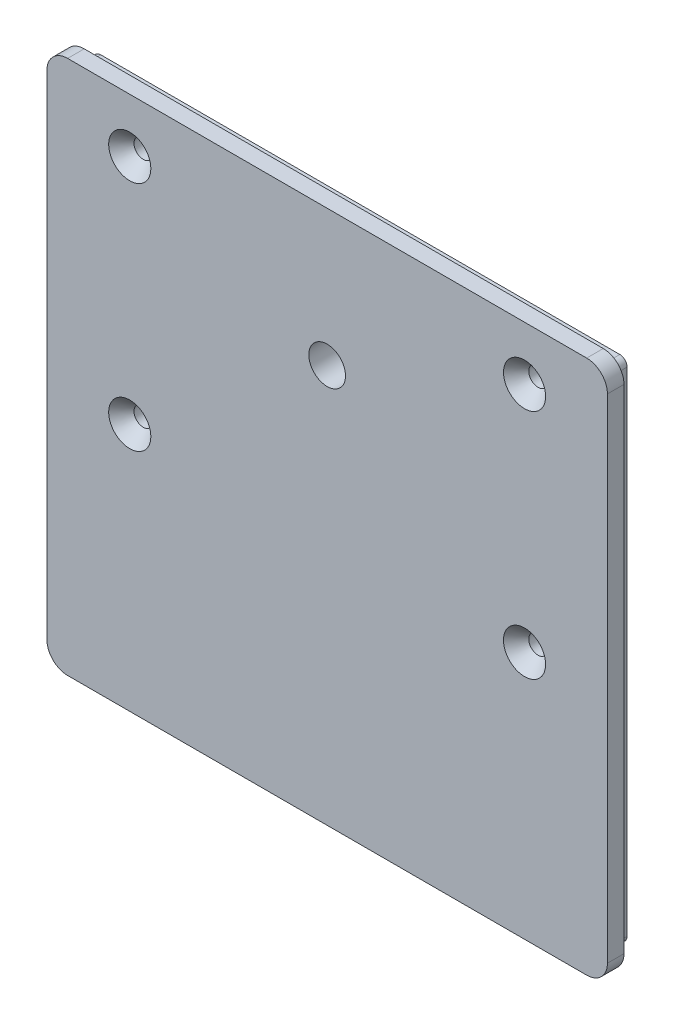
ISO-10303-21;
HEADER;
FILE_DESCRIPTION(('STEP AP214'),'2;1');
FILE_NAME('part.step','',(''),(''),'','','');
FILE_SCHEMA(('AUTOMOTIVE_DESIGN { 1 0 10303 214 1 1 1 1 }'));
ENDSEC;
DATA;
#1=APPLICATION_CONTEXT('core data for automotive mechanical design processes');
#2=APPLICATION_PROTOCOL_DEFINITION('international standard','automotive_design',2000,#1);
#3=PRODUCT_CONTEXT('',#1,'mechanical');
#4=PRODUCT('Part','Part','',(#3));
#5=PRODUCT_RELATED_PRODUCT_CATEGORY('part','',(#4));
#6=PRODUCT_DEFINITION_FORMATION('','',#4);
#7=PRODUCT_DEFINITION_CONTEXT('part definition',#1,'design');
#8=PRODUCT_DEFINITION('design','',#6,#7);
#9=PRODUCT_DEFINITION_SHAPE('','',#8);
#10=(LENGTH_UNIT() NAMED_UNIT(*) SI_UNIT(.MILLI.,.METRE.));
#11=(NAMED_UNIT(*) PLANE_ANGLE_UNIT() SI_UNIT($,.RADIAN.));
#12=(NAMED_UNIT(*) SI_UNIT($,.STERADIAN.) SOLID_ANGLE_UNIT());
#13=UNCERTAINTY_MEASURE_WITH_UNIT(LENGTH_MEASURE(1.E-05),#10,'distance_accuracy_value','');
#14=(GEOMETRIC_REPRESENTATION_CONTEXT(3) GLOBAL_UNCERTAINTY_ASSIGNED_CONTEXT((#13)) GLOBAL_UNIT_ASSIGNED_CONTEXT((#10,
#11,#12)) REPRESENTATION_CONTEXT('',''));
#15=CARTESIAN_POINT('',(0.,0.,0.));
#16=DIRECTION('',(0.,0.,1.));
#17=DIRECTION('',(1.,0.,0.));
#18=AXIS2_PLACEMENT_3D('',#15,#16,#17);
#19=CARTESIAN_POINT('',(161.822706366671,-36.,24.1107205623901));
#20=DIRECTION('',(0.,0.,-1.));
#21=DIRECTION('',(-1.,0.,0.));
#22=AXIS2_PLACEMENT_3D('',#19,#20,#21);
#23=PLANE('',#22);
#24=DIRECTION('',(0.,1.,0.));
#25=VECTOR('',#24,1.);
#26=CARTESIAN_POINT('',(-59.542618629174,-51.,24.1107205623902));
#27=LINE('',#26,#25);
#28=CARTESIAN_POINT('',(-59.542618629174,-51.,24.1107205623902));
#29=VERTEX_POINT('',#28);
#30=CARTESIAN_POINT('',(-59.542618629174,68.,24.1107205623902));
#31=VERTEX_POINT('',#30);
#32=EDGE_CURVE('E179',#29,#31,#27,.T.);
#33=ORIENTED_EDGE('',*,*,#32,.T.);
#34=CARTESIAN_POINT('',(-57.792618629174,68.,24.1107205623902));
#35=DIRECTION('',(0.,0.,-1.));
#36=DIRECTION('',(-1.,0.,0.));
#37=AXIS2_PLACEMENT_3D('',#34,#35,#36);
#38=CIRCLE('',#37,1.75000000000001);
#39=CARTESIAN_POINT('',(-57.792618629174,69.75,24.1107205623902));
#40=VERTEX_POINT('',#39);
#41=EDGE_CURVE('E202',#31,#40,#38,.T.);
#42=ORIENTED_EDGE('',*,*,#41,.T.);
#43=DIRECTION('',(1.,0.,0.));
#44=VECTOR('',#43,1.);
#45=CARTESIAN_POINT('',(-57.792618629174,69.75,24.1107205623902));
#46=LINE('',#45,#44);
#47=CARTESIAN_POINT('',(67.5,69.75,24.1107205623901));
#48=VERTEX_POINT('',#47);
#49=EDGE_CURVE('E159',#40,#48,#46,.T.);
#50=ORIENTED_EDGE('',*,*,#49,.T.);
#51=CARTESIAN_POINT('',(67.5,68.,24.1107205623902));
#52=DIRECTION('',(0.,0.,-1.));
#53=DIRECTION('',(-1.,0.,0.));
#54=AXIS2_PLACEMENT_3D('',#51,#52,#53);
#55=CIRCLE('',#54,1.74999999999998);
#56=CARTESIAN_POINT('',(69.25,68.,24.1107205623902));
#57=VERTEX_POINT('',#56);
#58=EDGE_CURVE('E56',#48,#57,#55,.T.);
#59=ORIENTED_EDGE('',*,*,#58,.T.);
#60=DIRECTION('',(0.,-1.,0.));
#61=VECTOR('',#60,1.);
#62=CARTESIAN_POINT('',(69.25,68.,24.1107205623902));
#63=LINE('',#62,#61);
#64=CARTESIAN_POINT('',(69.25,-51.,24.1107205623902));
#65=VERTEX_POINT('',#64);
#66=EDGE_CURVE('E206',#57,#65,#63,.T.);
#67=ORIENTED_EDGE('',*,*,#66,.T.);
#68=CARTESIAN_POINT('',(67.5,-51.,24.1107205623902));
#69=DIRECTION('',(0.,0.,-1.));
#70=DIRECTION('',(-1.,0.,0.));
#71=AXIS2_PLACEMENT_3D('',#68,#69,#70);
#72=CIRCLE('',#71,1.75000000000001);
#73=CARTESIAN_POINT('',(67.5,-52.75,24.1107205623902));
#74=VERTEX_POINT('',#73);
#75=EDGE_CURVE('E209',#65,#74,#72,.T.);
#76=ORIENTED_EDGE('',*,*,#75,.T.);
#77=DIRECTION('',(-1.,0.,0.));
#78=VECTOR('',#77,1.);
#79=CARTESIAN_POINT('',(67.5,-52.75,24.1107205623902));
#80=LINE('',#79,#78);
#81=CARTESIAN_POINT('',(-57.792618629174,-52.75,24.1107205623902));
#82=VERTEX_POINT('',#81);
#83=EDGE_CURVE('E212',#74,#82,#80,.T.);
#84=ORIENTED_EDGE('',*,*,#83,.T.);
#85=CARTESIAN_POINT('',(-57.792618629174,-51.,24.1107205623902));
#86=DIRECTION('',(0.,0.,-1.));
#87=DIRECTION('',(-1.,0.,0.));
#88=AXIS2_PLACEMENT_3D('',#85,#86,#87);
#89=CIRCLE('',#88,1.74999999999999);
#90=EDGE_CURVE('E182',#82,#29,#89,.T.);
#91=ORIENTED_EDGE('',*,*,#90,.T.);
#92=EDGE_LOOP('',(#33,#42,#50,#59,#67,#76,#84,#91));
#93=FACE_BOUND('',#92,.T.);
#94=CARTESIAN_POINT('',(-42.792618629174,60.,24.1107205623902));
#95=DIRECTION('',(0.,0.,1.));
#96=DIRECTION('',(0.,-1.,0.));
#97=AXIS2_PLACEMENT_3D('',#94,#95,#96);
#98=CIRCLE('',#97,2.2479);
#99=CARTESIAN_POINT('',(-42.792618629174,57.7521,24.1107205623902));
#100=VERTEX_POINT('',#99);
#101=EDGE_CURVE('E459',#100,#100,#98,.F.);
#102=ORIENTED_EDGE('',*,*,#101,.F.);
#103=EDGE_LOOP('',(#102));
#104=FACE_BOUND('',#103,.T.);
#105=CARTESIAN_POINT('',(52.5,60.,24.1107205623902));
#106=DIRECTION('',(0.,0.,1.));
#107=DIRECTION('',(0.,-1.,0.));
#108=AXIS2_PLACEMENT_3D('',#105,#106,#107);
#109=CIRCLE('',#108,2.2479);
#110=CARTESIAN_POINT('',(52.5,57.7521,24.1107205623902));
#111=VERTEX_POINT('',#110);
#112=EDGE_CURVE('E457',#111,#111,#109,.F.);
#113=ORIENTED_EDGE('',*,*,#112,.F.);
#114=EDGE_LOOP('',(#113));
#115=FACE_BOUND('',#114,.T.);
#116=CARTESIAN_POINT('',(4.85369068541301,40.1596321826041,24.1107205623902));
#117=DIRECTION('',(0.,0.,-1.));
#118=DIRECTION('',(-1.,0.,0.));
#119=AXIS2_PLACEMENT_3D('',#116,#117,#118);
#120=CIRCLE('',#119,4.43);
#121=CARTESIAN_POINT('',(0.42369068541301,40.1596321826041,24.1107205623902));
#122=VERTEX_POINT('',#121);
#123=EDGE_CURVE('E185',#122,#122,#120,.F.);
#124=ORIENTED_EDGE('',*,*,#123,.T.);
#125=EDGE_LOOP('',(#124));
#126=FACE_BOUND('',#125,.T.);
#127=CARTESIAN_POINT('',(-42.792618629174,4.,24.1107205623902));
#128=DIRECTION('',(0.,0.,1.));
#129=DIRECTION('',(0.,-1.,0.));
#130=AXIS2_PLACEMENT_3D('',#127,#128,#129);
#131=CIRCLE('',#130,2.2479);
#132=CARTESIAN_POINT('',(-42.792618629174,1.7521,24.1107205623902));
#133=VERTEX_POINT('',#132);
#134=EDGE_CURVE('E419',#133,#133,#131,.F.);
#135=ORIENTED_EDGE('',*,*,#134,.F.);
#136=EDGE_LOOP('',(#135));
#137=FACE_BOUND('',#136,.T.);
#138=CARTESIAN_POINT('',(52.5,4.,24.1107205623902));
#139=DIRECTION('',(0.,0.,1.));
#140=DIRECTION('',(0.,-1.,0.));
#141=AXIS2_PLACEMENT_3D('',#138,#139,#140);
#142=CIRCLE('',#141,2.2479);
#143=CARTESIAN_POINT('',(52.5,1.7521,24.1107205623902));
#144=VERTEX_POINT('',#143);
#145=EDGE_CURVE('E414',#144,#144,#142,.F.);
#146=ORIENTED_EDGE('',*,*,#145,.F.);
#147=EDGE_LOOP('',(#146));
#148=FACE_BOUND('',#147,.T.);
#149=ADVANCED_FACE('F41',(#93,#104,#115,#126,#137,#148),#23,.T.);
#150=CARTESIAN_POINT('',(-57.792618629174,-51.,28.1107205623902));
#151=DIRECTION('',(0.,0.,-1.));
#152=DIRECTION('',(-1.,0.,0.));
#153=AXIS2_PLACEMENT_3D('',#150,#151,#152);
#154=PLANE('',#153);
#155=DIRECTION('',(0.,1.,0.));
#156=VECTOR('',#155,1.);
#157=CARTESIAN_POINT('',(-59.542618629174,-51.,28.1107205623902));
#158=LINE('',#157,#156);
#159=CARTESIAN_POINT('',(-59.542618629174,-51.,28.1107205623902));
#160=VERTEX_POINT('',#159);
#161=CARTESIAN_POINT('',(-59.542618629174,68.,28.1107205623902));
#162=VERTEX_POINT('',#161);
#163=EDGE_CURVE('E165',#160,#162,#158,.T.);
#164=ORIENTED_EDGE('',*,*,#163,.F.);
#165=CARTESIAN_POINT('',(-57.792618629174,-51.,28.1107205623902));
#166=DIRECTION('',(0.,0.,-1.));
#167=DIRECTION('',(-1.,0.,0.));
#168=AXIS2_PLACEMENT_3D('',#165,#166,#167);
#169=CIRCLE('',#168,1.74999999999999);
#170=CARTESIAN_POINT('',(-57.792618629174,-52.75,28.1107205623902));
#171=VERTEX_POINT('',#170);
#172=EDGE_CURVE('E198',#171,#160,#169,.T.);
#173=ORIENTED_EDGE('',*,*,#172,.F.);
#174=DIRECTION('',(-1.,0.,0.));
#175=VECTOR('',#174,1.);
#176=CARTESIAN_POINT('',(67.5,-52.75,28.1107205623902));
#177=LINE('',#176,#175);
#178=CARTESIAN_POINT('',(67.5,-52.75,28.1107205623902));
#179=VERTEX_POINT('',#178);
#180=EDGE_CURVE('E195',#179,#171,#177,.T.);
#181=ORIENTED_EDGE('',*,*,#180,.F.);
#182=CARTESIAN_POINT('',(67.5,-51.,28.1107205623902));
#183=DIRECTION('',(0.,0.,-1.));
#184=DIRECTION('',(-1.,0.,0.));
#185=AXIS2_PLACEMENT_3D('',#182,#183,#184);
#186=CIRCLE('',#185,1.75000000000001);
#187=CARTESIAN_POINT('',(69.25,-51.,28.1107205623902));
#188=VERTEX_POINT('',#187);
#189=EDGE_CURVE('E192',#188,#179,#186,.T.);
#190=ORIENTED_EDGE('',*,*,#189,.F.);
#191=DIRECTION('',(0.,-1.,0.));
#192=VECTOR('',#191,1.);
#193=CARTESIAN_POINT('',(69.25,68.,28.1107205623902));
#194=LINE('',#193,#192);
#195=CARTESIAN_POINT('',(69.25,68.,28.1107205623902));
#196=VERTEX_POINT('',#195);
#197=EDGE_CURVE('E189',#196,#188,#194,.T.);
#198=ORIENTED_EDGE('',*,*,#197,.F.);
#199=CARTESIAN_POINT('',(67.5,68.,28.1107205623902));
#200=DIRECTION('',(0.,0.,-1.));
#201=DIRECTION('',(-1.,0.,0.));
#202=AXIS2_PLACEMENT_3D('',#199,#200,#201);
#203=CIRCLE('',#202,1.74999999999998);
#204=CARTESIAN_POINT('',(67.5,69.75,28.1107205623902));
#205=VERTEX_POINT('',#204);
#206=EDGE_CURVE('E175',#205,#196,#203,.T.);
#207=ORIENTED_EDGE('',*,*,#206,.F.);
#208=DIRECTION('',(1.,0.,0.));
#209=VECTOR('',#208,1.);
#210=CARTESIAN_POINT('',(-57.792618629174,69.75,28.1107205623902));
#211=LINE('',#210,#209);
#212=CARTESIAN_POINT('',(-57.792618629174,69.75,28.1107205623902));
#213=VERTEX_POINT('',#212);
#214=EDGE_CURVE('E157',#213,#205,#211,.T.);
#215=ORIENTED_EDGE('',*,*,#214,.F.);
#216=CARTESIAN_POINT('',(-57.792618629174,68.,28.1107205623902));
#217=DIRECTION('',(0.,0.,-1.));
#218=DIRECTION('',(-1.,0.,0.));
#219=AXIS2_PLACEMENT_3D('',#216,#217,#218);
#220=CIRCLE('',#219,1.75000000000001);
#221=EDGE_CURVE('E171',#162,#213,#220,.T.);
#222=ORIENTED_EDGE('',*,*,#221,.F.);
#223=EDGE_LOOP('',(#164,#173,#181,#190,#198,#207,#215,#222));
#224=FACE_BOUND('',#223,.T.);
#225=CARTESIAN_POINT('',(-57.792618629174,-51.,28.1107205623902));
#226=DIRECTION('',(0.,0.,-1.));
#227=DIRECTION('',(-1.,0.,0.));
#228=AXIS2_PLACEMENT_3D('',#225,#226,#227);
#229=CIRCLE('',#228,4.99999999999999);
#230=CARTESIAN_POINT('',(-57.792618629174,-56.,28.1107205623902));
#231=VERTEX_POINT('',#230);
#232=CARTESIAN_POINT('',(-62.792618629174,-51.,28.1107205623902));
#233=VERTEX_POINT('',#232);
#234=EDGE_CURVE('E218',#231,#233,#229,.T.);
#235=ORIENTED_EDGE('',*,*,#234,.T.);
#236=DIRECTION('',(0.,1.,0.));
#237=VECTOR('',#236,1.);
#238=CARTESIAN_POINT('',(-62.792618629174,-51.,28.1107205623902));
#239=LINE('',#238,#237);
#240=CARTESIAN_POINT('',(-62.792618629174,68.,28.1107205623902));
#241=VERTEX_POINT('',#240);
#242=EDGE_CURVE('E231',#233,#241,#239,.T.);
#243=ORIENTED_EDGE('',*,*,#242,.T.);
#244=CARTESIAN_POINT('',(-57.792618629174,68.,28.1107205623902));
#245=DIRECTION('',(0.,0.,-1.));
#246=DIRECTION('',(-1.,0.,0.));
#247=AXIS2_PLACEMENT_3D('',#244,#245,#246);
#248=CIRCLE('',#247,4.99999999999999);
#249=CARTESIAN_POINT('',(-57.792618629174,73.,28.1107205623902));
#250=VERTEX_POINT('',#249);
#251=EDGE_CURVE('E233',#241,#250,#248,.T.);
#252=ORIENTED_EDGE('',*,*,#251,.T.);
#253=DIRECTION('',(1.,0.,0.));
#254=VECTOR('',#253,1.);
#255=CARTESIAN_POINT('',(-57.792618629174,73.,28.1107205623902));
#256=LINE('',#255,#254);
#257=CARTESIAN_POINT('',(67.5,73.,28.1107205623902));
#258=VERTEX_POINT('',#257);
#259=EDGE_CURVE('E235',#250,#258,#256,.T.);
#260=ORIENTED_EDGE('',*,*,#259,.T.);
#261=CARTESIAN_POINT('',(67.5,68.,28.1107205623902));
#262=DIRECTION('',(0.,0.,-1.));
#263=DIRECTION('',(-1.,0.,0.));
#264=AXIS2_PLACEMENT_3D('',#261,#262,#263);
#265=CIRCLE('',#264,5.);
#266=CARTESIAN_POINT('',(72.5,68.,28.1107205623902));
#267=VERTEX_POINT('',#266);
#268=EDGE_CURVE('E237',#258,#267,#265,.T.);
#269=ORIENTED_EDGE('',*,*,#268,.T.);
#270=DIRECTION('',(0.,-1.,0.));
#271=VECTOR('',#270,1.);
#272=CARTESIAN_POINT('',(72.5,68.,28.1107205623902));
#273=LINE('',#272,#271);
#274=CARTESIAN_POINT('',(72.5,-51.,28.1107205623902));
#275=VERTEX_POINT('',#274);
#276=EDGE_CURVE('E239',#267,#275,#273,.T.);
#277=ORIENTED_EDGE('',*,*,#276,.T.);
#278=CARTESIAN_POINT('',(67.5,-51.,28.1107205623902));
#279=DIRECTION('',(0.,0.,-1.));
#280=DIRECTION('',(-1.,0.,0.));
#281=AXIS2_PLACEMENT_3D('',#278,#279,#280);
#282=CIRCLE('',#281,5.00000000000002);
#283=CARTESIAN_POINT('',(67.5,-56.,28.1107205623902));
#284=VERTEX_POINT('',#283);
#285=EDGE_CURVE('E241',#275,#284,#282,.T.);
#286=ORIENTED_EDGE('',*,*,#285,.T.);
#287=DIRECTION('',(-1.,0.,0.));
#288=VECTOR('',#287,1.);
#289=CARTESIAN_POINT('',(67.5,-56.,28.1107205623902));
#290=LINE('',#289,#288);
#291=EDGE_CURVE('E64',#284,#231,#290,.T.);
#292=ORIENTED_EDGE('',*,*,#291,.T.);
#293=EDGE_LOOP('',(#235,#243,#252,#260,#269,#277,#286,#292));
#294=FACE_BOUND('',#293,.T.);
#295=ADVANCED_FACE('F170',(#224,#294),#154,.T.);
#296=CARTESIAN_POINT('',(-57.792618629174,68.,28.1107205623902));
#297=DIRECTION('',(0.,0.,-1.));
#298=DIRECTION('',(-1.,0.,0.));
#299=AXIS2_PLACEMENT_3D('',#296,#297,#298);
#300=CYLINDRICAL_SURFACE('',#299,1.75000000000001);
#301=ORIENTED_EDGE('',*,*,#41,.F.);
#302=DIRECTION('',(0.,0.,-1.));
#303=VECTOR('',#302,1.);
#304=CARTESIAN_POINT('',(-59.542618629174,68.,28.1107205623902));
#305=LINE('',#304,#303);
#306=EDGE_CURVE('E178',#162,#31,#305,.T.);
#307=ORIENTED_EDGE('',*,*,#306,.F.);
#308=ORIENTED_EDGE('',*,*,#221,.T.);
#309=DIRECTION('',(0.,0.,-1.));
#310=VECTOR('',#309,1.);
#311=CARTESIAN_POINT('',(-57.792618629174,69.75,28.1107205623902));
#312=LINE('',#311,#310);
#313=EDGE_CURVE('E154',#213,#40,#312,.T.);
#314=ORIENTED_EDGE('',*,*,#313,.T.);
#315=EDGE_LOOP('',(#301,#307,#308,#314));
#316=FACE_BOUND('',#315,.T.);
#317=ADVANCED_FACE('F177',(#316),#300,.T.);
#318=CARTESIAN_POINT('',(-59.542618629174,-51.,28.1107205623902));
#319=DIRECTION('',(-1.,0.,0.));
#320=DIRECTION('',(0.,-1.,0.));
#321=AXIS2_PLACEMENT_3D('',#318,#319,#320);
#322=PLANE('',#321);
#323=ORIENTED_EDGE('',*,*,#32,.F.);
#324=DIRECTION('',(0.,0.,-1.));
#325=VECTOR('',#324,1.);
#326=CARTESIAN_POINT('',(-59.542618629174,-51.,28.1107205623902));
#327=LINE('',#326,#325);
#328=EDGE_CURVE('E219',#160,#29,#327,.T.);
#329=ORIENTED_EDGE('',*,*,#328,.F.);
#330=ORIENTED_EDGE('',*,*,#163,.T.);
#331=ORIENTED_EDGE('',*,*,#306,.T.);
#332=EDGE_LOOP('',(#323,#329,#330,#331));
#333=FACE_BOUND('',#332,.T.);
#334=ADVANCED_FACE('F349',(#333),#322,.T.);
#335=CARTESIAN_POINT('',(-57.792618629174,-51.,28.1107205623902));
#336=DIRECTION('',(0.,0.,-1.));
#337=DIRECTION('',(-1.,0.,0.));
#338=AXIS2_PLACEMENT_3D('',#335,#336,#337);
#339=CYLINDRICAL_SURFACE('',#338,1.74999999999999);
#340=ORIENTED_EDGE('',*,*,#90,.F.);
#341=DIRECTION('',(0.,0.,-1.));
#342=VECTOR('',#341,1.);
#343=CARTESIAN_POINT('',(-57.792618629174,-52.75,28.1107205623902));
#344=LINE('',#343,#342);
#345=EDGE_CURVE('E221',#171,#82,#344,.T.);
#346=ORIENTED_EDGE('',*,*,#345,.F.);
#347=ORIENTED_EDGE('',*,*,#172,.T.);
#348=ORIENTED_EDGE('',*,*,#328,.T.);
#349=EDGE_LOOP('',(#340,#346,#347,#348));
#350=FACE_BOUND('',#349,.T.);
#351=ADVANCED_FACE('F364',(#350),#339,.T.);
#352=CARTESIAN_POINT('',(67.5,-52.75,28.1107205623902));
#353=DIRECTION('',(0.,-1.,0.));
#354=DIRECTION('',(1.,0.,0.));
#355=AXIS2_PLACEMENT_3D('',#352,#353,#354);
#356=PLANE('',#355);
#357=ORIENTED_EDGE('',*,*,#83,.F.);
#358=DIRECTION('',(0.,0.,-1.));
#359=VECTOR('',#358,1.);
#360=CARTESIAN_POINT('',(67.5,-52.75,28.1107205623902));
#361=LINE('',#360,#359);
#362=EDGE_CURVE('E223',#179,#74,#361,.T.);
#363=ORIENTED_EDGE('',*,*,#362,.F.);
#364=ORIENTED_EDGE('',*,*,#180,.T.);
#365=ORIENTED_EDGE('',*,*,#345,.T.);
#366=EDGE_LOOP('',(#357,#363,#364,#365));
#367=FACE_BOUND('',#366,.T.);
#368=ADVANCED_FACE('F360',(#367),#356,.T.);
#369=CARTESIAN_POINT('',(67.5,-51.,28.1107205623902));
#370=DIRECTION('',(0.,0.,-1.));
#371=DIRECTION('',(-1.,0.,0.));
#372=AXIS2_PLACEMENT_3D('',#369,#370,#371);
#373=CYLINDRICAL_SURFACE('',#372,1.75000000000001);
#374=ORIENTED_EDGE('',*,*,#75,.F.);
#375=DIRECTION('',(0.,0.,-1.));
#376=VECTOR('',#375,1.);
#377=CARTESIAN_POINT('',(69.25,-51.,28.1107205623902));
#378=LINE('',#377,#376);
#379=EDGE_CURVE('E225',#188,#65,#378,.T.);
#380=ORIENTED_EDGE('',*,*,#379,.F.);
#381=ORIENTED_EDGE('',*,*,#189,.T.);
#382=ORIENTED_EDGE('',*,*,#362,.T.);
#383=EDGE_LOOP('',(#374,#380,#381,#382));
#384=FACE_BOUND('',#383,.T.);
#385=ADVANCED_FACE('F356',(#384),#373,.T.);
#386=CARTESIAN_POINT('',(69.25,68.,28.1107205623902));
#387=DIRECTION('',(1.,0.,0.));
#388=DIRECTION('',(0.,1.,0.));
#389=AXIS2_PLACEMENT_3D('',#386,#387,#388);
#390=PLANE('',#389);
#391=ORIENTED_EDGE('',*,*,#66,.F.);
#392=DIRECTION('',(0.,0.,-1.));
#393=VECTOR('',#392,1.);
#394=CARTESIAN_POINT('',(69.25,68.,28.1107205623902));
#395=LINE('',#394,#393);
#396=EDGE_CURVE('E227',#196,#57,#395,.T.);
#397=ORIENTED_EDGE('',*,*,#396,.F.);
#398=ORIENTED_EDGE('',*,*,#197,.T.);
#399=ORIENTED_EDGE('',*,*,#379,.T.);
#400=EDGE_LOOP('',(#391,#397,#398,#399));
#401=FACE_BOUND('',#400,.T.);
#402=ADVANCED_FACE('F353',(#401),#390,.T.);
#403=CARTESIAN_POINT('',(67.5,68.,28.1107205623902));
#404=DIRECTION('',(0.,0.,-1.));
#405=DIRECTION('',(-1.,0.,0.));
#406=AXIS2_PLACEMENT_3D('',#403,#404,#405);
#407=CYLINDRICAL_SURFACE('',#406,1.74999999999998);
#408=ORIENTED_EDGE('',*,*,#58,.F.);
#409=DIRECTION('',(0.,0.,-1.));
#410=VECTOR('',#409,1.);
#411=CARTESIAN_POINT('',(67.5,69.75,28.1107205623902));
#412=LINE('',#411,#410);
#413=EDGE_CURVE('E164',#205,#48,#412,.T.);
#414=ORIENTED_EDGE('',*,*,#413,.F.);
#415=ORIENTED_EDGE('',*,*,#206,.T.);
#416=ORIENTED_EDGE('',*,*,#396,.T.);
#417=EDGE_LOOP('',(#408,#414,#415,#416));
#418=FACE_BOUND('',#417,.T.);
#419=ADVANCED_FACE('F325',(#418),#407,.T.);
#420=CARTESIAN_POINT('',(-57.792618629174,69.75,28.1107205623902));
#421=DIRECTION('',(0.,1.,0.));
#422=DIRECTION('',(-1.,0.,0.));
#423=AXIS2_PLACEMENT_3D('',#420,#421,#422);
#424=PLANE('',#423);
#425=ORIENTED_EDGE('',*,*,#49,.F.);
#426=ORIENTED_EDGE('',*,*,#313,.F.);
#427=ORIENTED_EDGE('',*,*,#214,.T.);
#428=ORIENTED_EDGE('',*,*,#413,.T.);
#429=EDGE_LOOP('',(#425,#426,#427,#428));
#430=FACE_BOUND('',#429,.T.);
#431=ADVANCED_FACE('F156',(#430),#424,.T.);
#432=CARTESIAN_POINT('',(161.822706366671,-36.,32.1107205623901));
#433=DIRECTION('',(0.,0.,1.));
#434=DIRECTION('',(1.,0.,0.));
#435=AXIS2_PLACEMENT_3D('',#432,#433,#434);
#436=PLANE('',#435);
#437=CARTESIAN_POINT('',(-42.792618629174,60.,32.1107205623902));
#438=DIRECTION('',(0.,0.,1.));
#439=DIRECTION('',(1.,0.,0.));
#440=AXIS2_PLACEMENT_3D('',#437,#438,#439);
#441=CIRCLE('',#440,5.0856896);
#442=CARTESIAN_POINT('',(-37.706929029174,60.,32.1107205623902));
#443=VERTEX_POINT('',#442);
#444=EDGE_CURVE('E413',#443,#443,#441,.T.);
#445=ORIENTED_EDGE('',*,*,#444,.F.);
#446=EDGE_LOOP('',(#445));
#447=FACE_BOUND('',#446,.T.);
#448=CARTESIAN_POINT('',(52.5,60.,32.1107205623902));
#449=DIRECTION('',(0.,0.,1.));
#450=DIRECTION('',(1.,0.,0.));
#451=AXIS2_PLACEMENT_3D('',#448,#449,#450);
#452=CIRCLE('',#451,5.0856896);
#453=CARTESIAN_POINT('',(57.5856896,60.,32.1107205623902));
#454=VERTEX_POINT('',#453);
#455=EDGE_CURVE('E416',#454,#454,#452,.T.);
#456=ORIENTED_EDGE('',*,*,#455,.F.);
#457=EDGE_LOOP('',(#456));
#458=FACE_BOUND('',#457,.T.);
#459=CARTESIAN_POINT('',(-42.792618629174,4.,32.1107205623902));
#460=DIRECTION('',(0.,0.,1.));
#461=DIRECTION('',(1.,0.,0.));
#462=AXIS2_PLACEMENT_3D('',#459,#460,#461);
#463=CIRCLE('',#462,5.0856896);
#464=CARTESIAN_POINT('',(-37.706929029174,4.,32.1107205623902));
#465=VERTEX_POINT('',#464);
#466=EDGE_CURVE('E428',#465,#465,#463,.T.);
#467=ORIENTED_EDGE('',*,*,#466,.F.);
#468=EDGE_LOOP('',(#467));
#469=FACE_BOUND('',#468,.T.);
#470=CARTESIAN_POINT('',(52.5,4.,32.1107205623902));
#471=DIRECTION('',(0.,0.,1.));
#472=DIRECTION('',(1.,0.,0.));
#473=AXIS2_PLACEMENT_3D('',#470,#471,#472);
#474=CIRCLE('',#473,5.0856896);
#475=CARTESIAN_POINT('',(57.5856896,4.,32.1107205623902));
#476=VERTEX_POINT('',#475);
#477=EDGE_CURVE('E434',#476,#476,#474,.T.);
#478=ORIENTED_EDGE('',*,*,#477,.F.);
#479=EDGE_LOOP('',(#478));
#480=FACE_BOUND('',#479,.T.);
#481=CARTESIAN_POINT('',(4.85369068541301,40.1596321826041,32.1107205623902));
#482=DIRECTION('',(0.,0.,1.));
#483=DIRECTION('',(1.,0.,0.));
#484=AXIS2_PLACEMENT_3D('',#481,#482,#483);
#485=CIRCLE('',#484,4.43);
#486=CARTESIAN_POINT('',(9.28369068541301,40.1596321826041,32.1107205623902));
#487=VERTEX_POINT('',#486);
#488=EDGE_CURVE('E439',#487,#487,#485,.T.);
#489=ORIENTED_EDGE('',*,*,#488,.F.);
#490=EDGE_LOOP('',(#489));
#491=FACE_BOUND('',#490,.T.);
#492=DIRECTION('',(-1.,0.,0.));
#493=VECTOR('',#492,1.);
#494=CARTESIAN_POINT('',(72.5,73.,32.1107205623902));
#495=LINE('',#494,#493);
#496=CARTESIAN_POINT('',(67.5,73.,32.1107205623902));
#497=VERTEX_POINT('',#496);
#498=CARTESIAN_POINT('',(-57.792618629174,73.,32.1107205623902));
#499=VERTEX_POINT('',#498);
#500=EDGE_CURVE('E252',#497,#499,#495,.T.);
#501=ORIENTED_EDGE('',*,*,#500,.T.);
#502=CARTESIAN_POINT('',(-57.792618629174,68.,32.1107205623902));
#503=DIRECTION('',(0.,0.,1.));
#504=DIRECTION('',(1.,0.,0.));
#505=AXIS2_PLACEMENT_3D('',#502,#503,#504);
#506=CIRCLE('',#505,5.);
#507=CARTESIAN_POINT('',(-62.792618629174,68.,32.1107205623902));
#508=VERTEX_POINT('',#507);
#509=EDGE_CURVE('E267',#499,#508,#506,.T.);
#510=ORIENTED_EDGE('',*,*,#509,.T.);
#511=DIRECTION('',(0.,-1.,0.));
#512=VECTOR('',#511,1.);
#513=CARTESIAN_POINT('',(-62.792618629174,73.,32.1107205623902));
#514=LINE('',#513,#512);
#515=CARTESIAN_POINT('',(-62.792618629174,-51.,32.1107205623902));
#516=VERTEX_POINT('',#515);
#517=EDGE_CURVE('E249',#508,#516,#514,.T.);
#518=ORIENTED_EDGE('',*,*,#517,.T.);
#519=CARTESIAN_POINT('',(-57.792618629174,-51.,32.1107205623902));
#520=DIRECTION('',(0.,0.,1.));
#521=DIRECTION('',(1.,0.,0.));
#522=AXIS2_PLACEMENT_3D('',#519,#520,#521);
#523=CIRCLE('',#522,5.);
#524=CARTESIAN_POINT('',(-57.792618629174,-56.,32.1107205623902));
#525=VERTEX_POINT('',#524);
#526=EDGE_CURVE('E261',#516,#525,#523,.T.);
#527=ORIENTED_EDGE('',*,*,#526,.T.);
#528=DIRECTION('',(1.,0.,0.));
#529=VECTOR('',#528,1.);
#530=CARTESIAN_POINT('',(-62.792618629174,-56.,32.1107205623902));
#531=LINE('',#530,#529);
#532=CARTESIAN_POINT('',(67.5,-56.,32.1107205623902));
#533=VERTEX_POINT('',#532);
#534=EDGE_CURVE('E245',#525,#533,#531,.T.);
#535=ORIENTED_EDGE('',*,*,#534,.T.);
#536=CARTESIAN_POINT('',(67.5,-51.,32.1107205623901));
#537=DIRECTION('',(0.,0.,1.));
#538=DIRECTION('',(1.,0.,0.));
#539=AXIS2_PLACEMENT_3D('',#536,#537,#538);
#540=CIRCLE('',#539,5.);
#541=CARTESIAN_POINT('',(72.5,-51.,32.1107205623902));
#542=VERTEX_POINT('',#541);
#543=EDGE_CURVE('E263',#533,#542,#540,.T.);
#544=ORIENTED_EDGE('',*,*,#543,.T.);
#545=DIRECTION('',(0.,1.,0.));
#546=VECTOR('',#545,1.);
#547=CARTESIAN_POINT('',(72.5,-56.,32.1107205623902));
#548=LINE('',#547,#546);
#549=CARTESIAN_POINT('',(72.5,68.,32.1107205623902));
#550=VERTEX_POINT('',#549);
#551=EDGE_CURVE('E244',#542,#550,#548,.T.);
#552=ORIENTED_EDGE('',*,*,#551,.T.);
#553=CARTESIAN_POINT('',(67.5,68.,32.1107205623901));
#554=DIRECTION('',(0.,0.,1.));
#555=DIRECTION('',(1.,0.,0.));
#556=AXIS2_PLACEMENT_3D('',#553,#554,#555);
#557=CIRCLE('',#556,5.);
#558=EDGE_CURVE('E265',#550,#497,#557,.T.);
#559=ORIENTED_EDGE('',*,*,#558,.T.);
#560=EDGE_LOOP('',(#501,#510,#518,#527,#535,#544,#552,#559));
#561=FACE_BOUND('',#560,.T.);
#562=ADVANCED_FACE('F317',(#447,#458,#469,#480,#491,#561),#436,.T.);
#563=CARTESIAN_POINT('',(67.5,-51.,-162.825345127297));
#564=DIRECTION('',(0.,0.,1.));
#565=DIRECTION('',(1.,0.,0.));
#566=AXIS2_PLACEMENT_3D('',#563,#564,#565);
#567=CYLINDRICAL_SURFACE('',#566,5.);
#568=DIRECTION('',(0.,0.,1.));
#569=VECTOR('',#568,1.);
#570=CARTESIAN_POINT('',(67.5,-56.,-162.825345127297));
#571=LINE('',#570,#569);
#572=EDGE_CURVE('E11',#284,#533,#571,.T.);
#573=ORIENTED_EDGE('',*,*,#572,.F.);
#574=ORIENTED_EDGE('',*,*,#285,.F.);
#575=DIRECTION('',(0.,0.,1.));
#576=VECTOR('',#575,1.);
#577=CARTESIAN_POINT('',(72.5,-51.,-162.825345127297));
#578=LINE('',#577,#576);
#579=EDGE_CURVE('E274',#542,#275,#578,.F.);
#580=ORIENTED_EDGE('',*,*,#579,.F.);
#581=ORIENTED_EDGE('',*,*,#543,.F.);
#582=EDGE_LOOP('',(#573,#574,#580,#581));
#583=FACE_BOUND('',#582,.T.);
#584=ADVANCED_FACE('F315',(#583),#567,.T.);
#585=CARTESIAN_POINT('',(-57.792618629174,-51.,-162.825345127297));
#586=DIRECTION('',(0.,0.,1.));
#587=DIRECTION('',(1.,0.,0.));
#588=AXIS2_PLACEMENT_3D('',#585,#586,#587);
#589=CYLINDRICAL_SURFACE('',#588,5.);
#590=DIRECTION('',(0.,0.,1.));
#591=VECTOR('',#590,1.);
#592=CARTESIAN_POINT('',(-62.792618629174,-51.,-162.825345127297));
#593=LINE('',#592,#591);
#594=EDGE_CURVE('E269',#233,#516,#593,.T.);
#595=ORIENTED_EDGE('',*,*,#594,.F.);
#596=ORIENTED_EDGE('',*,*,#234,.F.);
#597=DIRECTION('',(0.,0.,1.));
#598=VECTOR('',#597,1.);
#599=CARTESIAN_POINT('',(-57.792618629174,-56.,-162.825345127297));
#600=LINE('',#599,#598);
#601=EDGE_CURVE('E49',#525,#231,#600,.F.);
#602=ORIENTED_EDGE('',*,*,#601,.F.);
#603=ORIENTED_EDGE('',*,*,#526,.F.);
#604=EDGE_LOOP('',(#595,#596,#602,#603));
#605=FACE_BOUND('',#604,.T.);
#606=ADVANCED_FACE('F43',(#605),#589,.T.);
#607=CARTESIAN_POINT('',(-57.792618629174,68.,-162.825345127297));
#608=DIRECTION('',(0.,0.,1.));
#609=DIRECTION('',(1.,0.,0.));
#610=AXIS2_PLACEMENT_3D('',#607,#608,#609);
#611=CYLINDRICAL_SURFACE('',#610,5.);
#612=DIRECTION('',(0.,0.,1.));
#613=VECTOR('',#612,1.);
#614=CARTESIAN_POINT('',(-57.792618629174,73.,-162.825345127297));
#615=LINE('',#614,#613);
#616=EDGE_CURVE('E259',#250,#499,#615,.T.);
#617=ORIENTED_EDGE('',*,*,#616,.F.);
#618=ORIENTED_EDGE('',*,*,#251,.F.);
#619=DIRECTION('',(0.,0.,1.));
#620=VECTOR('',#619,1.);
#621=CARTESIAN_POINT('',(-62.792618629174,68.,-162.825345127297));
#622=LINE('',#621,#620);
#623=EDGE_CURVE('E271',#508,#241,#622,.F.);
#624=ORIENTED_EDGE('',*,*,#623,.F.);
#625=ORIENTED_EDGE('',*,*,#509,.F.);
#626=EDGE_LOOP('',(#617,#618,#624,#625));
#627=FACE_BOUND('',#626,.T.);
#628=ADVANCED_FACE('F296',(#627),#611,.T.);
#629=CARTESIAN_POINT('',(67.5,68.,-162.825345127297));
#630=DIRECTION('',(0.,0.,1.));
#631=DIRECTION('',(1.,0.,0.));
#632=AXIS2_PLACEMENT_3D('',#629,#630,#631);
#633=CYLINDRICAL_SURFACE('',#632,5.);
#634=DIRECTION('',(0.,0.,1.));
#635=VECTOR('',#634,1.);
#636=CARTESIAN_POINT('',(72.5,68.,-162.825345127297));
#637=LINE('',#636,#635);
#638=EDGE_CURVE('E277',#267,#550,#637,.T.);
#639=ORIENTED_EDGE('',*,*,#638,.F.);
#640=ORIENTED_EDGE('',*,*,#268,.F.);
#641=DIRECTION('',(0.,0.,1.));
#642=VECTOR('',#641,1.);
#643=CARTESIAN_POINT('',(67.5,73.,-162.825345127297));
#644=LINE('',#643,#642);
#645=EDGE_CURVE('E248',#497,#258,#644,.F.);
#646=ORIENTED_EDGE('',*,*,#645,.F.);
#647=ORIENTED_EDGE('',*,*,#558,.F.);
#648=EDGE_LOOP('',(#639,#640,#646,#647));
#649=FACE_BOUND('',#648,.T.);
#650=ADVANCED_FACE('F306',(#649),#633,.T.);
#651=CARTESIAN_POINT('',(72.5,73.,-162.825345127297));
#652=DIRECTION('',(0.,1.,0.));
#653=DIRECTION('',(-1.,0.,0.));
#654=AXIS2_PLACEMENT_3D('',#651,#652,#653);
#655=PLANE('',#654);
#656=ORIENTED_EDGE('',*,*,#645,.T.);
#657=ORIENTED_EDGE('',*,*,#259,.F.);
#658=ORIENTED_EDGE('',*,*,#616,.T.);
#659=ORIENTED_EDGE('',*,*,#500,.F.);
#660=EDGE_LOOP('',(#656,#657,#658,#659));
#661=FACE_BOUND('',#660,.T.);
#662=ADVANCED_FACE('F300',(#661),#655,.T.);
#663=CARTESIAN_POINT('',(-62.792618629174,73.,-162.825345127297));
#664=DIRECTION('',(-1.,0.,0.));
#665=DIRECTION('',(0.,0.,1.));
#666=AXIS2_PLACEMENT_3D('',#663,#664,#665);
#667=PLANE('',#666);
#668=ORIENTED_EDGE('',*,*,#623,.T.);
#669=ORIENTED_EDGE('',*,*,#242,.F.);
#670=ORIENTED_EDGE('',*,*,#594,.T.);
#671=ORIENTED_EDGE('',*,*,#517,.F.);
#672=EDGE_LOOP('',(#668,#669,#670,#671));
#673=FACE_BOUND('',#672,.T.);
#674=ADVANCED_FACE('F290',(#673),#667,.T.);
#675=CARTESIAN_POINT('',(-62.792618629174,-56.,-162.825345127297));
#676=DIRECTION('',(0.,-1.,0.));
#677=DIRECTION('',(1.,0.,0.));
#678=AXIS2_PLACEMENT_3D('',#675,#676,#677);
#679=PLANE('',#678);
#680=ORIENTED_EDGE('',*,*,#601,.T.);
#681=ORIENTED_EDGE('',*,*,#291,.F.);
#682=ORIENTED_EDGE('',*,*,#572,.T.);
#683=ORIENTED_EDGE('',*,*,#534,.F.);
#684=EDGE_LOOP('',(#680,#681,#682,#683));
#685=FACE_BOUND('',#684,.T.);
#686=ADVANCED_FACE('F282',(#685),#679,.T.);
#687=CARTESIAN_POINT('',(72.5,-56.,-162.825345127297));
#688=DIRECTION('',(1.,0.,0.));
#689=DIRECTION('',(0.,0.,-1.));
#690=AXIS2_PLACEMENT_3D('',#687,#688,#689);
#691=PLANE('',#690);
#692=ORIENTED_EDGE('',*,*,#579,.T.);
#693=ORIENTED_EDGE('',*,*,#276,.F.);
#694=ORIENTED_EDGE('',*,*,#638,.T.);
#695=ORIENTED_EDGE('',*,*,#551,.F.);
#696=EDGE_LOOP('',(#692,#693,#694,#695));
#697=FACE_BOUND('',#696,.T.);
#698=ADVANCED_FACE('F310',(#697),#691,.T.);
#699=CARTESIAN_POINT('',(4.85369068541301,40.1596321826041,11.5807883997645));
#700=DIRECTION('',(0.,0.,1.));
#701=DIRECTION('',(1.,0.,0.));
#702=AXIS2_PLACEMENT_3D('',#699,#700,#701);
#703=CYLINDRICAL_SURFACE('',#702,4.43);
#704=ORIENTED_EDGE('',*,*,#488,.T.);
#705=EDGE_LOOP('',(#704));
#706=FACE_BOUND('',#705,.T.);
#707=ORIENTED_EDGE('',*,*,#123,.F.);
#708=EDGE_LOOP('',(#707));
#709=FACE_BOUND('',#708,.T.);
#710=ADVANCED_FACE('F341',(#706,#709),#703,.F.);
#711=CARTESIAN_POINT('',(52.5,4.,32.1107205623902));
#712=DIRECTION('',(0.,0.,1.));
#713=DIRECTION('',(1.,0.,0.));
#714=AXIS2_PLACEMENT_3D('',#711,#712,#713);
#715=CYLINDRICAL_SURFACE('',#714,2.2479);
#716=ORIENTED_EDGE('',*,*,#145,.T.);
#717=EDGE_LOOP('',(#716));
#718=FACE_BOUND('',#717,.T.);
#719=CARTESIAN_POINT('',(52.5,4.,28.8462170602098));
#720=DIRECTION('',(0.,0.,1.));
#721=DIRECTION('',(1.,0.,0.));
#722=AXIS2_PLACEMENT_3D('',#719,#720,#721);
#723=CIRCLE('',#722,2.2479);
#724=CARTESIAN_POINT('',(54.7479,4.,28.8462170602098));
#725=VERTEX_POINT('',#724);
#726=EDGE_CURVE('E437',#725,#725,#723,.T.);
#727=ORIENTED_EDGE('',*,*,#726,.T.);
#728=EDGE_LOOP('',(#727));
#729=FACE_BOUND('',#728,.T.);
#730=ADVANCED_FACE('F374',(#718,#729),#715,.F.);
#731=CARTESIAN_POINT('',(52.5,4.,32.1107205623902));
#732=DIRECTION('',(0.,0.,1.));
#733=DIRECTION('',(1.,0.,0.));
#734=AXIS2_PLACEMENT_3D('',#731,#732,#733);
#735=CONICAL_SURFACE('',#734,5.0856896,0.715584993317675);
#736=ORIENTED_EDGE('',*,*,#726,.F.);
#737=EDGE_LOOP('',(#736));
#738=FACE_BOUND('',#737,.T.);
#739=ORIENTED_EDGE('',*,*,#477,.T.);
#740=EDGE_LOOP('',(#739));
#741=FACE_BOUND('',#740,.T.);
#742=ADVANCED_FACE('F378',(#738,#741),#735,.F.);
#743=CARTESIAN_POINT('',(-42.792618629174,4.,32.1107205623902));
#744=DIRECTION('',(0.,0.,1.));
#745=DIRECTION('',(1.,0.,0.));
#746=AXIS2_PLACEMENT_3D('',#743,#744,#745);
#747=CYLINDRICAL_SURFACE('',#746,2.2479);
#748=ORIENTED_EDGE('',*,*,#134,.T.);
#749=EDGE_LOOP('',(#748));
#750=FACE_BOUND('',#749,.T.);
#751=CARTESIAN_POINT('',(-42.792618629174,4.,28.8462170602098));
#752=DIRECTION('',(0.,0.,1.));
#753=DIRECTION('',(1.,0.,0.));
#754=AXIS2_PLACEMENT_3D('',#751,#752,#753);
#755=CIRCLE('',#754,2.2479);
#756=CARTESIAN_POINT('',(-40.544718629174,4.,28.8462170602098));
#757=VERTEX_POINT('',#756);
#758=EDGE_CURVE('E431',#757,#757,#755,.T.);
#759=ORIENTED_EDGE('',*,*,#758,.T.);
#760=EDGE_LOOP('',(#759));
#761=FACE_BOUND('',#760,.T.);
#762=ADVANCED_FACE('F382',(#750,#761),#747,.F.);
#763=CARTESIAN_POINT('',(-42.792618629174,4.,32.1107205623902));
#764=DIRECTION('',(0.,0.,1.));
#765=DIRECTION('',(1.,0.,0.));
#766=AXIS2_PLACEMENT_3D('',#763,#764,#765);
#767=CONICAL_SURFACE('',#766,5.0856896,0.715584993317675);
#768=ORIENTED_EDGE('',*,*,#758,.F.);
#769=EDGE_LOOP('',(#768));
#770=FACE_BOUND('',#769,.T.);
#771=ORIENTED_EDGE('',*,*,#466,.T.);
#772=EDGE_LOOP('',(#771));
#773=FACE_BOUND('',#772,.T.);
#774=ADVANCED_FACE('F386',(#770,#773),#767,.F.);
#775=CARTESIAN_POINT('',(52.5,60.,32.1107205623902));
#776=DIRECTION('',(0.,0.,1.));
#777=DIRECTION('',(1.,0.,0.));
#778=AXIS2_PLACEMENT_3D('',#775,#776,#777);
#779=CYLINDRICAL_SURFACE('',#778,2.2479);
#780=ORIENTED_EDGE('',*,*,#112,.T.);
#781=EDGE_LOOP('',(#780));
#782=FACE_BOUND('',#781,.T.);
#783=CARTESIAN_POINT('',(52.5,60.,28.8462170602098));
#784=DIRECTION('',(0.,0.,1.));
#785=DIRECTION('',(1.,0.,0.));
#786=AXIS2_PLACEMENT_3D('',#783,#784,#785);
#787=CIRCLE('',#786,2.2479);
#788=CARTESIAN_POINT('',(54.7479,60.,28.8462170602098));
#789=VERTEX_POINT('',#788);
#790=EDGE_CURVE('E425',#789,#789,#787,.T.);
#791=ORIENTED_EDGE('',*,*,#790,.T.);
#792=EDGE_LOOP('',(#791));
#793=FACE_BOUND('',#792,.T.);
#794=ADVANCED_FACE('F390',(#782,#793),#779,.F.);
#795=CARTESIAN_POINT('',(52.5,60.,32.1107205623902));
#796=DIRECTION('',(0.,0.,1.));
#797=DIRECTION('',(1.,0.,0.));
#798=AXIS2_PLACEMENT_3D('',#795,#796,#797);
#799=CONICAL_SURFACE('',#798,5.0856896,0.715584993317675);
#800=ORIENTED_EDGE('',*,*,#790,.F.);
#801=EDGE_LOOP('',(#800));
#802=FACE_BOUND('',#801,.T.);
#803=ORIENTED_EDGE('',*,*,#455,.T.);
#804=EDGE_LOOP('',(#803));
#805=FACE_BOUND('',#804,.T.);
#806=ADVANCED_FACE('F394',(#802,#805),#799,.F.);
#807=CARTESIAN_POINT('',(-42.792618629174,60.,32.1107205623902));
#808=DIRECTION('',(0.,0.,1.));
#809=DIRECTION('',(1.,0.,0.));
#810=AXIS2_PLACEMENT_3D('',#807,#808,#809);
#811=CYLINDRICAL_SURFACE('',#810,2.2479);
#812=ORIENTED_EDGE('',*,*,#101,.T.);
#813=EDGE_LOOP('',(#812));
#814=FACE_BOUND('',#813,.T.);
#815=CARTESIAN_POINT('',(-42.792618629174,60.,28.8462170602098));
#816=DIRECTION('',(0.,0.,1.));
#817=DIRECTION('',(1.,0.,0.));
#818=AXIS2_PLACEMENT_3D('',#815,#816,#817);
#819=CIRCLE('',#818,2.2479);
#820=CARTESIAN_POINT('',(-40.544718629174,60.,28.8462170602098));
#821=VERTEX_POINT('',#820);
#822=EDGE_CURVE('E411',#821,#821,#819,.T.);
#823=ORIENTED_EDGE('',*,*,#822,.T.);
#824=EDGE_LOOP('',(#823));
#825=FACE_BOUND('',#824,.T.);
#826=ADVANCED_FACE('F398',(#814,#825),#811,.F.);
#827=CARTESIAN_POINT('',(-42.792618629174,60.,32.1107205623902));
#828=DIRECTION('',(0.,0.,1.));
#829=DIRECTION('',(1.,0.,0.));
#830=AXIS2_PLACEMENT_3D('',#827,#828,#829);
#831=CONICAL_SURFACE('',#830,5.0856896,0.715584993317675);
#832=ORIENTED_EDGE('',*,*,#822,.F.);
#833=EDGE_LOOP('',(#832));
#834=FACE_BOUND('',#833,.T.);
#835=ORIENTED_EDGE('',*,*,#444,.T.);
#836=EDGE_LOOP('',(#835));
#837=FACE_BOUND('',#836,.T.);
#838=ADVANCED_FACE('F402',(#834,#837),#831,.F.);
#839=CLOSED_SHELL('',(#149,#295,#317,#334,#351,#368,#385,#402,#419,#431,#562,#584,#606,#628,
#650,#662,#674,#686,#698,#710,#730,#742,#762,#774,#794,#806,#826,#838));
#840=MANIFOLD_SOLID_BREP('B2',#839);
#841=ADVANCED_BREP_SHAPE_REPRESENTATION('',(#18,#840),#14);
#842=SHAPE_DEFINITION_REPRESENTATION(#9,#841);
ENDSEC;
END-ISO-10303-21;
